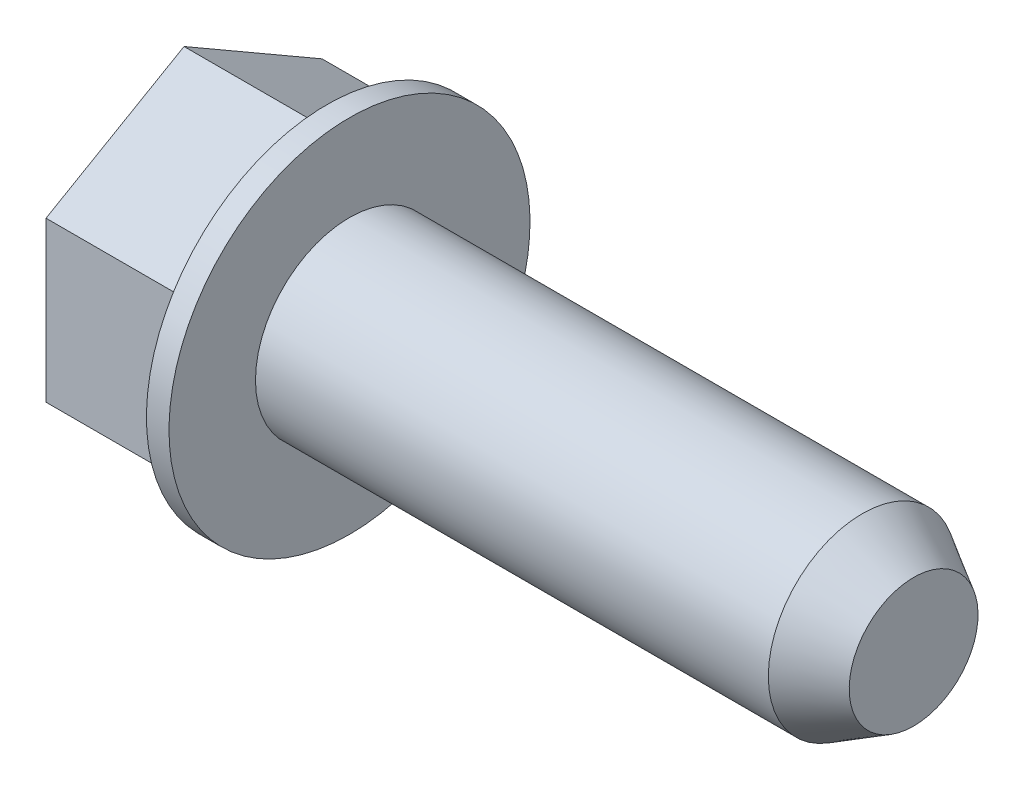
ISO-10303-21;
HEADER;
FILE_DESCRIPTION(('STEP AP214'),'2;1');
FILE_NAME('part.step','',(''),(''),'','','');
FILE_SCHEMA(('AUTOMOTIVE_DESIGN { 1 0 10303 214 1 1 1 1 }'));
ENDSEC;
DATA;
#1=APPLICATION_CONTEXT('core data for automotive mechanical design processes');
#2=APPLICATION_PROTOCOL_DEFINITION('international standard','automotive_design',2000,#1);
#3=PRODUCT_CONTEXT('',#1,'mechanical');
#4=PRODUCT('Part','Part','',(#3));
#5=PRODUCT_RELATED_PRODUCT_CATEGORY('part','',(#4));
#6=PRODUCT_DEFINITION_FORMATION('','',#4);
#7=PRODUCT_DEFINITION_CONTEXT('part definition',#1,'design');
#8=PRODUCT_DEFINITION('design','',#6,#7);
#9=PRODUCT_DEFINITION_SHAPE('','',#8);
#10=(LENGTH_UNIT() NAMED_UNIT(*) SI_UNIT(.MILLI.,.METRE.));
#11=(NAMED_UNIT(*) PLANE_ANGLE_UNIT() SI_UNIT($,.RADIAN.));
#12=(NAMED_UNIT(*) SI_UNIT($,.STERADIAN.) SOLID_ANGLE_UNIT());
#13=UNCERTAINTY_MEASURE_WITH_UNIT(LENGTH_MEASURE(1.E-05),#10,'distance_accuracy_value','');
#14=(GEOMETRIC_REPRESENTATION_CONTEXT(3) GLOBAL_UNCERTAINTY_ASSIGNED_CONTEXT((#13)) GLOBAL_UNIT_ASSIGNED_CONTEXT((#10,
#11,#12)) REPRESENTATION_CONTEXT('',''));
#15=CARTESIAN_POINT('',(0.,0.,0.));
#16=DIRECTION('',(0.,0.,1.));
#17=DIRECTION('',(1.,0.,0.));
#18=AXIS2_PLACEMENT_3D('',#15,#16,#17);
#19=CARTESIAN_POINT('',(3.8608,6.096,0.));
#20=DIRECTION('',(1.,0.,0.));
#21=DIRECTION('',(0.,1.,0.));
#22=AXIS2_PLACEMENT_3D('',#19,#20,#21);
#23=PLANE('',#22);
#24=CARTESIAN_POINT('',(3.8608,0.,0.));
#25=DIRECTION('',(-1.,0.,0.));
#26=DIRECTION('',(0.,-1.,0.));
#27=AXIS2_PLACEMENT_3D('',#24,#25,#26);
#28=CIRCLE('',#27,6.096);
#29=CARTESIAN_POINT('',(3.8608,-6.096,0.));
#30=VERTEX_POINT('',#29);
#31=EDGE_CURVE('E122',#30,#30,#28,.T.);
#32=ORIENTED_EDGE('',*,*,#31,.T.);
#33=EDGE_LOOP('',(#32));
#34=FACE_BOUND('',#33,.T.);
#35=DIRECTION('',(0.,-1.,0.));
#36=VECTOR('',#35,1.);
#37=CARTESIAN_POINT('',(3.8608,2.69097186966593,-4.6609));
#38=LINE('',#37,#36);
#39=CARTESIAN_POINT('',(3.8608,2.69097186966593,-4.6609));
#40=VERTEX_POINT('',#39);
#41=CARTESIAN_POINT('',(3.8608,-2.69097186966593,-4.6609));
#42=VERTEX_POINT('',#41);
#43=EDGE_CURVE('E58',#40,#42,#38,.T.);
#44=ORIENTED_EDGE('',*,*,#43,.F.);
#45=DIRECTION('',(0.,-0.5,-0.866025403784439));
#46=VECTOR('',#45,1.);
#47=CARTESIAN_POINT('',(3.8608,5.38194373933186,0.));
#48=LINE('',#47,#46);
#49=CARTESIAN_POINT('',(3.8608,5.38194373933186,0.));
#50=VERTEX_POINT('',#49);
#51=EDGE_CURVE('E51',#50,#40,#48,.T.);
#52=ORIENTED_EDGE('',*,*,#51,.F.);
#53=DIRECTION('',(0.,0.5,-0.866025403784438));
#54=VECTOR('',#53,1.);
#55=CARTESIAN_POINT('',(3.8608,2.69097186966593,4.6609));
#56=LINE('',#55,#54);
#57=CARTESIAN_POINT('',(3.8608,2.69097186966593,4.6609));
#58=VERTEX_POINT('',#57);
#59=EDGE_CURVE('E103',#58,#50,#56,.T.);
#60=ORIENTED_EDGE('',*,*,#59,.F.);
#61=DIRECTION('',(0.,1.,0.));
#62=VECTOR('',#61,1.);
#63=CARTESIAN_POINT('',(3.8608,-2.69097186966593,4.6609));
#64=LINE('',#63,#62);
#65=CARTESIAN_POINT('',(3.8608,-2.69097186966593,4.6609));
#66=VERTEX_POINT('',#65);
#67=EDGE_CURVE('E93',#66,#58,#64,.T.);
#68=ORIENTED_EDGE('',*,*,#67,.F.);
#69=DIRECTION('',(0.,0.5,0.866025403784439));
#70=VECTOR('',#69,1.);
#71=CARTESIAN_POINT('',(3.8608,-5.38194373933185,0.));
#72=LINE('',#71,#70);
#73=CARTESIAN_POINT('',(3.8608,-5.38194373933185,0.));
#74=VERTEX_POINT('',#73);
#75=EDGE_CURVE('E187',#74,#66,#72,.T.);
#76=ORIENTED_EDGE('',*,*,#75,.F.);
#77=DIRECTION('',(0.,-0.5,0.866025403784439));
#78=VECTOR('',#77,1.);
#79=CARTESIAN_POINT('',(3.8608,-2.69097186966592,-4.6609));
#80=LINE('',#79,#78);
#81=EDGE_CURVE('E192',#42,#74,#80,.T.);
#82=ORIENTED_EDGE('',*,*,#81,.F.);
#83=EDGE_LOOP('',(#44,#52,#60,#68,#76,#82));
#84=FACE_BOUND('',#83,.T.);
#85=ADVANCED_FACE('F36',(#34,#84),#23,.F.);
#86=CARTESIAN_POINT('',(23.6728,3.175,0.));
#87=DIRECTION('',(-1.,0.,0.));
#88=DIRECTION('',(0.,-1.,0.));
#89=AXIS2_PLACEMENT_3D('',#86,#87,#88);
#90=PLANE('',#89);
#91=CARTESIAN_POINT('',(23.6728,0.,0.));
#92=DIRECTION('',(-1.,0.,0.));
#93=DIRECTION('',(0.,-1.,0.));
#94=AXIS2_PLACEMENT_3D('',#91,#92,#93);
#95=CIRCLE('',#94,2.17499999999999);
#96=CARTESIAN_POINT('',(23.6728,-2.17499999999999,0.));
#97=VERTEX_POINT('',#96);
#98=EDGE_CURVE('E11',#97,#97,#95,.F.);
#99=ORIENTED_EDGE('',*,*,#98,.T.);
#100=EDGE_LOOP('',(#99));
#101=FACE_BOUND('',#100,.T.);
#102=ADVANCED_FACE('F148',(#101),#90,.F.);
#103=CARTESIAN_POINT('',(4.6228,0.,0.));
#104=DIRECTION('',(-1.,0.,0.));
#105=DIRECTION('',(0.,-1.,0.));
#106=AXIS2_PLACEMENT_3D('',#103,#104,#105);
#107=CYLINDRICAL_SURFACE('',#106,3.175);
#108=CARTESIAN_POINT('',(21.9407491924311,0.,0.));
#109=DIRECTION('',(-1.,0.,0.));
#110=DIRECTION('',(0.,-1.,0.));
#111=AXIS2_PLACEMENT_3D('',#108,#109,#110);
#112=CIRCLE('',#111,3.175);
#113=CARTESIAN_POINT('',(21.9407491924311,-3.175,0.));
#114=VERTEX_POINT('',#113);
#115=EDGE_CURVE('E44',#114,#114,#112,.T.);
#116=ORIENTED_EDGE('',*,*,#115,.T.);
#117=EDGE_LOOP('',(#116));
#118=FACE_BOUND('',#117,.T.);
#119=CARTESIAN_POINT('',(4.6228,0.,0.));
#120=DIRECTION('',(-1.,0.,0.));
#121=DIRECTION('',(0.,-1.,0.));
#122=AXIS2_PLACEMENT_3D('',#119,#120,#121);
#123=CIRCLE('',#122,3.175);
#124=CARTESIAN_POINT('',(4.6228,-3.175,0.));
#125=VERTEX_POINT('',#124);
#126=EDGE_CURVE('E129',#125,#125,#123,.T.);
#127=ORIENTED_EDGE('',*,*,#126,.F.);
#128=EDGE_LOOP('',(#127));
#129=FACE_BOUND('',#128,.T.);
#130=ADVANCED_FACE('F134',(#118,#129),#107,.T.);
#131=CARTESIAN_POINT('',(4.6228,3.175,0.));
#132=DIRECTION('',(-1.,0.,0.));
#133=DIRECTION('',(0.,-1.,0.));
#134=AXIS2_PLACEMENT_3D('',#131,#132,#133);
#135=PLANE('',#134);
#136=CARTESIAN_POINT('',(4.6228,0.,0.));
#137=DIRECTION('',(-1.,0.,0.));
#138=DIRECTION('',(0.,-1.,0.));
#139=AXIS2_PLACEMENT_3D('',#136,#137,#138);
#140=CIRCLE('',#139,6.096);
#141=CARTESIAN_POINT('',(4.6228,-6.096,0.));
#142=VERTEX_POINT('',#141);
#143=EDGE_CURVE('E125',#142,#142,#140,.T.);
#144=ORIENTED_EDGE('',*,*,#143,.F.);
#145=EDGE_LOOP('',(#144));
#146=FACE_BOUND('',#145,.T.);
#147=ORIENTED_EDGE('',*,*,#126,.T.);
#148=EDGE_LOOP('',(#147));
#149=FACE_BOUND('',#148,.T.);
#150=ADVANCED_FACE('F163',(#146,#149),#135,.F.);
#151=CARTESIAN_POINT('',(4.6228,0.,0.));
#152=DIRECTION('',(-1.,0.,0.));
#153=DIRECTION('',(0.,-1.,0.));
#154=AXIS2_PLACEMENT_3D('',#151,#152,#153);
#155=CYLINDRICAL_SURFACE('',#154,6.096);
#156=ORIENTED_EDGE('',*,*,#31,.F.);
#157=EDGE_LOOP('',(#156));
#158=FACE_BOUND('',#157,.T.);
#159=ORIENTED_EDGE('',*,*,#143,.T.);
#160=EDGE_LOOP('',(#159));
#161=FACE_BOUND('',#160,.T.);
#162=ADVANCED_FACE('F159',(#158,#161),#155,.T.);
#163=CARTESIAN_POINT('',(-15.2044847044131,-5.38194373933185,0.));
#164=DIRECTION('',(0.,0.866025403784439,-0.5));
#165=DIRECTION('',(0.,0.5,0.866025403784439));
#166=AXIS2_PLACEMENT_3D('',#163,#164,#165);
#167=PLANE('',#166);
#168=ORIENTED_EDGE('',*,*,#75,.T.);
#169=DIRECTION('',(1.,0.,0.));
#170=VECTOR('',#169,1.);
#171=CARTESIAN_POINT('',(-15.2044847044131,-2.69097186966593,4.6609));
#172=LINE('',#171,#170);
#173=CARTESIAN_POINT('',(-0.965199999999999,-2.69097186966593,4.6609));
#174=VERTEX_POINT('',#173);
#175=EDGE_CURVE('E100',#174,#66,#172,.T.);
#176=ORIENTED_EDGE('',*,*,#175,.F.);
#177=DIRECTION('',(0.,-0.5,-0.866025403784439));
#178=VECTOR('',#177,1.);
#179=CARTESIAN_POINT('',(-0.965199999999999,-5.38194373933185,0.));
#180=LINE('',#179,#178);
#181=CARTESIAN_POINT('',(-0.965199999999999,-5.38194373933185,0.));
#182=VERTEX_POINT('',#181);
#183=EDGE_CURVE('E112',#174,#182,#180,.T.);
#184=ORIENTED_EDGE('',*,*,#183,.T.);
#185=DIRECTION('',(1.,0.,0.));
#186=VECTOR('',#185,1.);
#187=CARTESIAN_POINT('',(-15.2044847044131,-5.38194373933185,0.));
#188=LINE('',#187,#186);
#189=EDGE_CURVE('E188',#182,#74,#188,.T.);
#190=ORIENTED_EDGE('',*,*,#189,.T.);
#191=EDGE_LOOP('',(#168,#176,#184,#190));
#192=FACE_BOUND('',#191,.T.);
#193=ADVANCED_FACE('F162',(#192),#167,.F.);
#194=CARTESIAN_POINT('',(-15.2044847044131,-2.69097186966592,-4.6609));
#195=DIRECTION('',(0.,0.866025403784439,0.5));
#196=DIRECTION('',(0.,-0.5,0.866025403784439));
#197=AXIS2_PLACEMENT_3D('',#194,#195,#196);
#198=PLANE('',#197);
#199=ORIENTED_EDGE('',*,*,#81,.T.);
#200=ORIENTED_EDGE('',*,*,#189,.F.);
#201=DIRECTION('',(0.,0.5,-0.866025403784439));
#202=VECTOR('',#201,1.);
#203=CARTESIAN_POINT('',(-0.965199999999999,-2.69097186966592,-4.6609));
#204=LINE('',#203,#202);
#205=CARTESIAN_POINT('',(-0.965199999999999,-2.69097186966592,-4.6609));
#206=VERTEX_POINT('',#205);
#207=EDGE_CURVE('E116',#182,#206,#204,.T.);
#208=ORIENTED_EDGE('',*,*,#207,.T.);
#209=DIRECTION('',(1.,0.,0.));
#210=VECTOR('',#209,1.);
#211=CARTESIAN_POINT('',(-15.2044847044131,-2.69097186966592,-4.6609));
#212=LINE('',#211,#210);
#213=EDGE_CURVE('E190',#206,#42,#212,.T.);
#214=ORIENTED_EDGE('',*,*,#213,.T.);
#215=EDGE_LOOP('',(#199,#200,#208,#214));
#216=FACE_BOUND('',#215,.T.);
#217=ADVANCED_FACE('F210',(#216),#198,.F.);
#218=CARTESIAN_POINT('',(-15.2044847044131,2.69097186966593,-4.6609));
#219=DIRECTION('',(0.,0.,1.));
#220=DIRECTION('',(0.,-1.,0.));
#221=AXIS2_PLACEMENT_3D('',#218,#219,#220);
#222=PLANE('',#221);
#223=ORIENTED_EDGE('',*,*,#43,.T.);
#224=ORIENTED_EDGE('',*,*,#213,.F.);
#225=DIRECTION('',(0.,1.,0.));
#226=VECTOR('',#225,1.);
#227=CARTESIAN_POINT('',(-0.965199999999999,2.69097186966593,-4.6609));
#228=LINE('',#227,#226);
#229=CARTESIAN_POINT('',(-0.965199999999999,2.69097186966593,-4.6609));
#230=VERTEX_POINT('',#229);
#231=EDGE_CURVE('E199',#206,#230,#228,.T.);
#232=ORIENTED_EDGE('',*,*,#231,.T.);
#233=DIRECTION('',(1.,0.,0.));
#234=VECTOR('',#233,1.);
#235=CARTESIAN_POINT('',(-15.2044847044131,2.69097186966593,-4.6609));
#236=LINE('',#235,#234);
#237=EDGE_CURVE('E118',#230,#40,#236,.T.);
#238=ORIENTED_EDGE('',*,*,#237,.T.);
#239=EDGE_LOOP('',(#223,#224,#232,#238));
#240=FACE_BOUND('',#239,.T.);
#241=ADVANCED_FACE('F198',(#240),#222,.F.);
#242=CARTESIAN_POINT('',(-15.2044847044131,5.38194373933186,0.));
#243=DIRECTION('',(0.,-0.866025403784439,0.5));
#244=DIRECTION('',(0.,-0.5,-0.866025403784439));
#245=AXIS2_PLACEMENT_3D('',#242,#243,#244);
#246=PLANE('',#245);
#247=ORIENTED_EDGE('',*,*,#51,.T.);
#248=ORIENTED_EDGE('',*,*,#237,.F.);
#249=DIRECTION('',(0.,0.5,0.866025403784439));
#250=VECTOR('',#249,1.);
#251=CARTESIAN_POINT('',(-0.965199999999999,5.38194373933186,0.));
#252=LINE('',#251,#250);
#253=CARTESIAN_POINT('',(-0.965199999999999,5.38194373933186,0.));
#254=VERTEX_POINT('',#253);
#255=EDGE_CURVE('E202',#230,#254,#252,.T.);
#256=ORIENTED_EDGE('',*,*,#255,.T.);
#257=DIRECTION('',(1.,0.,0.));
#258=VECTOR('',#257,1.);
#259=CARTESIAN_POINT('',(-15.2044847044131,5.38194373933186,0.));
#260=LINE('',#259,#258);
#261=EDGE_CURVE('E113',#254,#50,#260,.T.);
#262=ORIENTED_EDGE('',*,*,#261,.T.);
#263=EDGE_LOOP('',(#247,#248,#256,#262));
#264=FACE_BOUND('',#263,.T.);
#265=ADVANCED_FACE('F201',(#264),#246,.F.);
#266=CARTESIAN_POINT('',(-15.2044847044131,2.69097186966593,4.6609));
#267=DIRECTION('',(0.,-0.866025403784438,-0.5));
#268=DIRECTION('',(0.,0.5,-0.866025403784439));
#269=AXIS2_PLACEMENT_3D('',#266,#267,#268);
#270=PLANE('',#269);
#271=ORIENTED_EDGE('',*,*,#59,.T.);
#272=ORIENTED_EDGE('',*,*,#261,.F.);
#273=DIRECTION('',(0.,-0.5,0.866025403784439));
#274=VECTOR('',#273,1.);
#275=CARTESIAN_POINT('',(-0.965199999999999,2.69097186966593,4.6609));
#276=LINE('',#275,#274);
#277=CARTESIAN_POINT('',(-0.965199999999999,2.69097186966593,4.6609));
#278=VERTEX_POINT('',#277);
#279=EDGE_CURVE('E111',#254,#278,#276,.T.);
#280=ORIENTED_EDGE('',*,*,#279,.T.);
#281=DIRECTION('',(1.,0.,0.));
#282=VECTOR('',#281,1.);
#283=CARTESIAN_POINT('',(-15.2044847044131,2.69097186966593,4.6609));
#284=LINE('',#283,#282);
#285=EDGE_CURVE('E98',#278,#58,#284,.T.);
#286=ORIENTED_EDGE('',*,*,#285,.T.);
#287=EDGE_LOOP('',(#271,#272,#280,#286));
#288=FACE_BOUND('',#287,.T.);
#289=ADVANCED_FACE('F110',(#288),#270,.F.);
#290=CARTESIAN_POINT('',(-15.2044847044131,-2.69097186966593,4.6609));
#291=DIRECTION('',(0.,0.,-1.));
#292=DIRECTION('',(0.,1.,0.));
#293=AXIS2_PLACEMENT_3D('',#290,#291,#292);
#294=PLANE('',#293);
#295=ORIENTED_EDGE('',*,*,#67,.T.);
#296=ORIENTED_EDGE('',*,*,#285,.F.);
#297=DIRECTION('',(0.,-1.,0.));
#298=VECTOR('',#297,1.);
#299=CARTESIAN_POINT('',(-0.965199999999999,-2.69097186966593,4.6609));
#300=LINE('',#299,#298);
#301=EDGE_CURVE('E126',#278,#174,#300,.T.);
#302=ORIENTED_EDGE('',*,*,#301,.T.);
#303=ORIENTED_EDGE('',*,*,#175,.T.);
#304=EDGE_LOOP('',(#295,#296,#302,#303));
#305=FACE_BOUND('',#304,.T.);
#306=ADVANCED_FACE('F95',(#305),#294,.F.);
#307=CARTESIAN_POINT('',(-0.9652,4.6609,0.));
#308=DIRECTION('',(1.,0.,0.));
#309=DIRECTION('',(0.,1.,0.));
#310=AXIS2_PLACEMENT_3D('',#307,#308,#309);
#311=PLANE('',#310);
#312=CARTESIAN_POINT('',(-0.9652,0.,0.));
#313=DIRECTION('',(-1.,0.,0.));
#314=DIRECTION('',(0.,-1.,0.));
#315=AXIS2_PLACEMENT_3D('',#312,#313,#314);
#316=CIRCLE('',#315,3.72872);
#317=CARTESIAN_POINT('',(-0.965200000000001,-3.72872,0.));
#318=VERTEX_POINT('',#317);
#319=EDGE_CURVE('E181',#318,#318,#316,.T.);
#320=ORIENTED_EDGE('',*,*,#319,.F.);
#321=EDGE_LOOP('',(#320));
#322=FACE_BOUND('',#321,.T.);
#323=ORIENTED_EDGE('',*,*,#183,.F.);
#324=ORIENTED_EDGE('',*,*,#301,.F.);
#325=ORIENTED_EDGE('',*,*,#279,.F.);
#326=ORIENTED_EDGE('',*,*,#255,.F.);
#327=ORIENTED_EDGE('',*,*,#231,.F.);
#328=ORIENTED_EDGE('',*,*,#207,.F.);
#329=EDGE_LOOP('',(#323,#324,#325,#326,#327,#328));
#330=FACE_BOUND('',#329,.T.);
#331=ADVANCED_FACE('F169',(#322,#330),#311,.F.);
#332=CARTESIAN_POINT('',(0.,0.,0.));
#333=DIRECTION('',(-1.,0.,0.));
#334=DIRECTION('',(0.,-1.,0.));
#335=AXIS2_PLACEMENT_3D('',#332,#333,#334);
#336=CYLINDRICAL_SURFACE('',#335,3.72872);
#337=CARTESIAN_POINT('',(0.,0.,0.));
#338=DIRECTION('',(-1.,0.,0.));
#339=DIRECTION('',(0.,-1.,0.));
#340=AXIS2_PLACEMENT_3D('',#337,#338,#339);
#341=CIRCLE('',#340,3.72872);
#342=CARTESIAN_POINT('',(0.,-3.72872,0.));
#343=VERTEX_POINT('',#342);
#344=EDGE_CURVE('E104',#343,#343,#341,.T.);
#345=CARTESIAN_POINT('',(0.,-3.72872,0.));
#346=CARTESIAN_POINT('',(-0.0100541666666673,-3.72872,0.));
#347=CARTESIAN_POINT('',(-0.0201083333333339,-3.72872,0.));
#348=CARTESIAN_POINT('',(-0.0402166666666673,-3.72872,0.));
#349=CARTESIAN_POINT('',(-0.0502708333333339,-3.72872,0.));
#350=CARTESIAN_POINT('',(-0.0703791666666673,-3.72872,0.));
#351=CARTESIAN_POINT('',(-0.0804333333333339,-3.72872,0.));
#352=CARTESIAN_POINT('',(-0.100541666666667,-3.72872,0.));
#353=CARTESIAN_POINT('',(-0.110595833333334,-3.72872,0.));
#354=CARTESIAN_POINT('',(-0.130704166666667,-3.72872,0.));
#355=CARTESIAN_POINT('',(-0.140758333333334,-3.72872,0.));
#356=CARTESIAN_POINT('',(-0.160866666666667,-3.72872,0.));
#357=CARTESIAN_POINT('',(-0.170920833333334,-3.72872,0.));
#358=CARTESIAN_POINT('',(-0.191029166666667,-3.72872,0.));
#359=CARTESIAN_POINT('',(-0.201083333333334,-3.72872,0.));
#360=CARTESIAN_POINT('',(-0.221191666666667,-3.72872,0.));
#361=CARTESIAN_POINT('',(-0.231245833333334,-3.72872,0.));
#362=CARTESIAN_POINT('',(-0.251354166666667,-3.72872,0.));
#363=CARTESIAN_POINT('',(-0.261408333333334,-3.72872,0.));
#364=CARTESIAN_POINT('',(-0.281516666666667,-3.72872,0.));
#365=CARTESIAN_POINT('',(-0.291570833333334,-3.72872,0.));
#366=CARTESIAN_POINT('',(-0.311679166666667,-3.72872,0.));
#367=CARTESIAN_POINT('',(-0.321733333333334,-3.72872,0.));
#368=CARTESIAN_POINT('',(-0.341841666666667,-3.72872,0.));
#369=CARTESIAN_POINT('',(-0.351895833333334,-3.72872,0.));
#370=CARTESIAN_POINT('',(-0.372004166666667,-3.72872,0.));
#371=CARTESIAN_POINT('',(-0.382058333333334,-3.72872,0.));
#372=CARTESIAN_POINT('',(-0.402166666666667,-3.72872,0.));
#373=CARTESIAN_POINT('',(-0.412220833333334,-3.72872,0.));
#374=CARTESIAN_POINT('',(-0.432329166666667,-3.72872,0.));
#375=CARTESIAN_POINT('',(-0.442383333333334,-3.72872,0.));
#376=CARTESIAN_POINT('',(-0.462491666666667,-3.72872,0.));
#377=CARTESIAN_POINT('',(-0.472545833333334,-3.72872,0.));
#378=CARTESIAN_POINT('',(-0.492654166666667,-3.72872,0.));
#379=CARTESIAN_POINT('',(-0.502708333333334,-3.72872,0.));
#380=CARTESIAN_POINT('',(-0.522816666666667,-3.72872,0.));
#381=CARTESIAN_POINT('',(-0.532870833333334,-3.72872,0.));
#382=CARTESIAN_POINT('',(-0.552979166666667,-3.72872,0.));
#383=CARTESIAN_POINT('',(-0.563033333333334,-3.72872,0.));
#384=CARTESIAN_POINT('',(-0.583141666666667,-3.72872,0.));
#385=CARTESIAN_POINT('',(-0.593195833333334,-3.72872,0.));
#386=CARTESIAN_POINT('',(-0.613304166666667,-3.72872,0.));
#387=CARTESIAN_POINT('',(-0.623358333333334,-3.72872,0.));
#388=CARTESIAN_POINT('',(-0.643466666666667,-3.72872,0.));
#389=CARTESIAN_POINT('',(-0.653520833333334,-3.72872,0.));
#390=CARTESIAN_POINT('',(-0.673629166666667,-3.72872,0.));
#391=CARTESIAN_POINT('',(-0.683683333333334,-3.72872,0.));
#392=CARTESIAN_POINT('',(-0.703791666666667,-3.72872,0.));
#393=CARTESIAN_POINT('',(-0.713845833333334,-3.72872,0.));
#394=CARTESIAN_POINT('',(-0.733954166666667,-3.72872,0.));
#395=CARTESIAN_POINT('',(-0.744008333333334,-3.72872,0.));
#396=CARTESIAN_POINT('',(-0.764116666666667,-3.72872,0.));
#397=CARTESIAN_POINT('',(-0.774170833333334,-3.72872,0.));
#398=CARTESIAN_POINT('',(-0.794279166666667,-3.72872,0.));
#399=CARTESIAN_POINT('',(-0.804333333333334,-3.72872,0.));
#400=CARTESIAN_POINT('',(-0.824441666666667,-3.72872,0.));
#401=CARTESIAN_POINT('',(-0.834495833333334,-3.72872,0.));
#402=CARTESIAN_POINT('',(-0.854604166666667,-3.72872,0.));
#403=CARTESIAN_POINT('',(-0.864658333333334,-3.72872,0.));
#404=CARTESIAN_POINT('',(-0.884766666666667,-3.72872,0.));
#405=CARTESIAN_POINT('',(-0.894820833333334,-3.72872,0.));
#406=CARTESIAN_POINT('',(-0.914929166666667,-3.72872,0.));
#407=CARTESIAN_POINT('',(-0.924983333333334,-3.72872,0.));
#408=CARTESIAN_POINT('',(-0.945091666666667,-3.72872,0.));
#409=CARTESIAN_POINT('',(-0.955145833333334,-3.72872,0.));
#410=CARTESIAN_POINT('',(-0.965200000000001,-3.72872,0.));
#411=B_SPLINE_CURVE_WITH_KNOTS('',3,(#345,#346,#347,#348,#349,#350,#351,#352,#353,#354,#355,
#356,#357,#358,#359,#360,#361,#362,#363,#364,#365,#366,#367,#368,#369,#370,#371,#372,#373,#374,
#375,#376,#377,#378,#379,#380,#381,#382,#383,#384,#385,#386,#387,#388,#389,#390,#391,#392,#393,
#394,#395,#396,#397,#398,#399,#400,#401,#402,#403,#404,#405,#406,#407,#408,#409,#410),
.UNSPECIFIED.,.F.,.F.,(4,2,2,2,2,2,2,2,2,2,2,2,2,2,2,2,2,2,2,2,2,2,2,2,2,2,2,2,2,2,2,2,4),(0.,
0.0301625,0.060325,0.0904875,0.12065,0.1508125,0.180975,0.2111375,0.2413,0.2714625,0.301625,
0.3317875,0.36195,0.3921125,0.422275,0.4524375,0.4826,0.5127625,0.542925,0.5730875,0.60325,
0.6334125,0.663575,0.6937375,0.7239,0.7540625,0.784225,0.8143875,0.84455,0.8747125,0.904875,
0.9350375,0.9652),.UNSPECIFIED.);
#412=EDGE_CURVE('BSEAM143',#343,#318,#411,.T.);
#413=ORIENTED_EDGE('',*,*,#344,.F.);
#414=ORIENTED_EDGE('',*,*,#319,.T.);
#415=ORIENTED_EDGE('',*,*,#412,.T.);
#416=ORIENTED_EDGE('',*,*,#412,.F.);
#417=EDGE_LOOP('',(#413,#415,#414,#416));
#418=FACE_BOUND('',#417,.T.);
#419=ADVANCED_FACE('F143',(#418),#336,.F.);
#420=CARTESIAN_POINT('',(0.,0.,0.));
#421=DIRECTION('',(-1.,0.,0.));
#422=DIRECTION('',(0.,-1.,0.));
#423=AXIS2_PLACEMENT_3D('',#420,#421,#422);
#424=PLANE('',#423);
#425=ORIENTED_EDGE('',*,*,#344,.T.);
#426=EDGE_LOOP('',(#425));
#427=FACE_BOUND('',#426,.T.);
#428=ADVANCED_FACE('F138',(#427),#424,.T.);
#429=CARTESIAN_POINT('',(21.9407491924311,0.,0.));
#430=DIRECTION('',(-1.,0.,0.));
#431=DIRECTION('',(0.,-1.,0.));
#432=AXIS2_PLACEMENT_3D('',#429,#430,#431);
#433=CONICAL_SURFACE('',#432,3.175,0.5235987755983);
#434=ORIENTED_EDGE('',*,*,#98,.F.);
#435=EDGE_LOOP('',(#434));
#436=FACE_BOUND('',#435,.T.);
#437=ORIENTED_EDGE('',*,*,#115,.F.);
#438=EDGE_LOOP('',(#437));
#439=FACE_BOUND('',#438,.T.);
#440=ADVANCED_FACE('F38',(#436,#439),#433,.T.);
#441=CLOSED_SHELL('',(#85,#102,#130,#150,#162,#193,#217,#241,#265,#289,#306,#331,#419,#428,#440));
#442=MANIFOLD_SOLID_BREP('B2',#441);
#443=ADVANCED_BREP_SHAPE_REPRESENTATION('',(#18,#442),#14);
#444=SHAPE_DEFINITION_REPRESENTATION(#9,#443);
ENDSEC;
END-ISO-10303-21;
